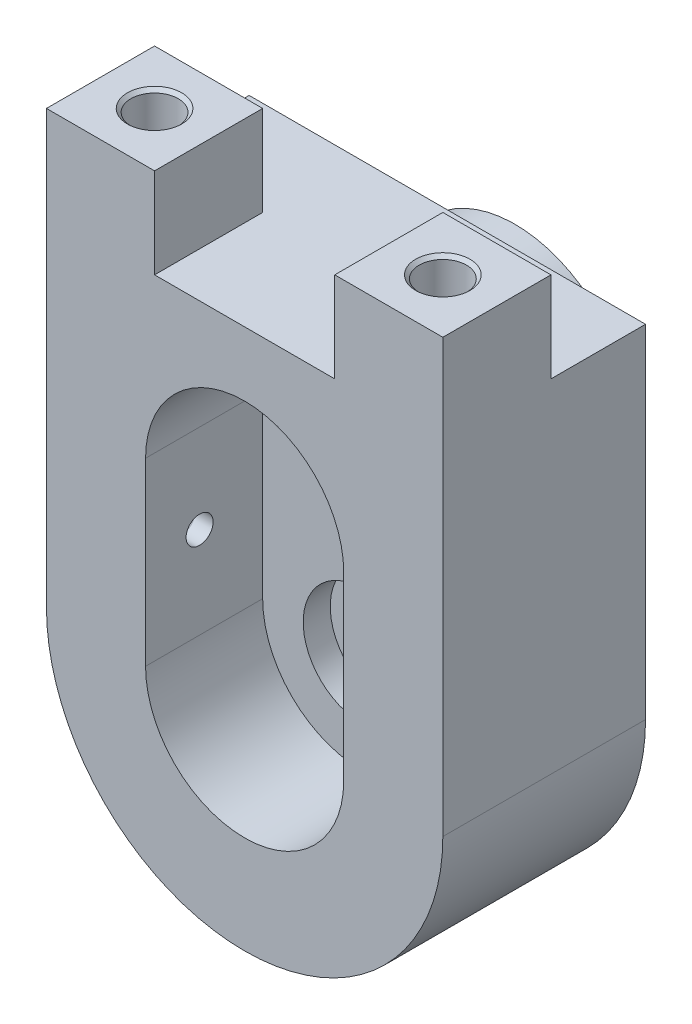
ISO-10303-21;
HEADER;
FILE_DESCRIPTION(('STEP AP214'),'2;1');
FILE_NAME('part.step','',(''),(''),'','','');
FILE_SCHEMA(('AUTOMOTIVE_DESIGN { 1 0 10303 214 1 1 1 1 }'));
ENDSEC;
DATA;
#1=APPLICATION_CONTEXT('core data for automotive mechanical design processes');
#2=APPLICATION_PROTOCOL_DEFINITION('international standard','automotive_design',2000,#1);
#3=PRODUCT_CONTEXT('',#1,'mechanical');
#4=PRODUCT('Part','Part','',(#3));
#5=PRODUCT_RELATED_PRODUCT_CATEGORY('part','',(#4));
#6=PRODUCT_DEFINITION_FORMATION('','',#4);
#7=PRODUCT_DEFINITION_CONTEXT('part definition',#1,'design');
#8=PRODUCT_DEFINITION('design','',#6,#7);
#9=PRODUCT_DEFINITION_SHAPE('','',#8);
#10=(LENGTH_UNIT() NAMED_UNIT(*) SI_UNIT(.MILLI.,.METRE.));
#11=(NAMED_UNIT(*) PLANE_ANGLE_UNIT() SI_UNIT($,.RADIAN.));
#12=(NAMED_UNIT(*) SI_UNIT($,.STERADIAN.) SOLID_ANGLE_UNIT());
#13=UNCERTAINTY_MEASURE_WITH_UNIT(LENGTH_MEASURE(1.E-05),#10,'distance_accuracy_value','');
#14=(GEOMETRIC_REPRESENTATION_CONTEXT(3) GLOBAL_UNCERTAINTY_ASSIGNED_CONTEXT((#13)) GLOBAL_UNIT_ASSIGNED_CONTEXT((#10,
#11,#12)) REPRESENTATION_CONTEXT('',''));
#15=CARTESIAN_POINT('',(0.,0.,0.));
#16=DIRECTION('',(0.,0.,1.));
#17=DIRECTION('',(1.,0.,0.));
#18=AXIS2_PLACEMENT_3D('',#15,#16,#17);
#19=CARTESIAN_POINT('',(-20.,56.2605194834472,45.));
#20=DIRECTION('',(-1.,0.,0.));
#21=DIRECTION('',(0.,0.,1.));
#22=AXIS2_PLACEMENT_3D('',#19,#20,#21);
#23=PLANE('',#22);
#24=DIRECTION('',(0.,0.,-1.));
#25=VECTOR('',#24,1.);
#26=CARTESIAN_POINT('',(-20.,36.2605194834471,45.));
#27=LINE('',#26,#25);
#28=CARTESIAN_POINT('',(-20.,36.2605194834471,45.));
#29=VERTEX_POINT('',#28);
#30=CARTESIAN_POINT('',(-20.,36.2605194834472,21.));
#31=VERTEX_POINT('',#30);
#32=EDGE_CURVE('E54',#29,#31,#27,.T.);
#33=ORIENTED_EDGE('',*,*,#32,.T.);
#34=DIRECTION('',(0.,1.,0.));
#35=VECTOR('',#34,1.);
#36=CARTESIAN_POINT('',(-20.,56.2605194834472,21.));
#37=LINE('',#36,#35);
#38=CARTESIAN_POINT('',(-20.,56.2605194834472,21.));
#39=VERTEX_POINT('',#38);
#40=EDGE_CURVE('E253',#31,#39,#37,.T.);
#41=ORIENTED_EDGE('',*,*,#40,.T.);
#42=DIRECTION('',(0.,0.,-1.));
#43=VECTOR('',#42,1.);
#44=CARTESIAN_POINT('',(-20.,56.2605194834472,45.));
#45=LINE('',#44,#43);
#46=CARTESIAN_POINT('',(-20.,56.2605194834472,45.));
#47=VERTEX_POINT('',#46);
#48=EDGE_CURVE('E376',#47,#39,#45,.T.);
#49=ORIENTED_EDGE('',*,*,#48,.F.);
#50=DIRECTION('',(0.,1.,0.));
#51=VECTOR('',#50,1.);
#52=CARTESIAN_POINT('',(-20.,56.2605194834472,45.));
#53=LINE('',#52,#51);
#54=EDGE_CURVE('E319',#29,#47,#53,.T.);
#55=ORIENTED_EDGE('',*,*,#54,.F.);
#56=EDGE_LOOP('',(#33,#41,#49,#55));
#57=FACE_BOUND('',#56,.T.);
#58=ADVANCED_FACE('F45',(#57),#23,.F.);
#59=CARTESIAN_POINT('',(-44.,56.2605194834472,45.));
#60=DIRECTION('',(0.,-1.,0.));
#61=DIRECTION('',(0.,0.,-1.));
#62=AXIS2_PLACEMENT_3D('',#59,#60,#61);
#63=PLANE('',#62);
#64=CARTESIAN_POINT('',(-32.,56.2605194834472,33.));
#65=DIRECTION('',(0.,1.,0.));
#66=DIRECTION('',(0.,0.,1.));
#67=AXIS2_PLACEMENT_3D('',#64,#65,#66);
#68=CIRCLE('',#67,6.025);
#69=CARTESIAN_POINT('',(-32.,56.2605194834472,39.025));
#70=VERTEX_POINT('',#69);
#71=EDGE_CURVE('E184',#70,#70,#68,.T.);
#72=ORIENTED_EDGE('',*,*,#71,.F.);
#73=EDGE_LOOP('',(#72));
#74=FACE_BOUND('',#73,.T.);
#75=ORIENTED_EDGE('',*,*,#48,.T.);
#76=DIRECTION('',(-1.,0.,0.));
#77=VECTOR('',#76,1.);
#78=CARTESIAN_POINT('',(-44.,56.2605194834472,21.));
#79=LINE('',#78,#77);
#80=CARTESIAN_POINT('',(-44.,56.2605194834472,21.));
#81=VERTEX_POINT('',#80);
#82=EDGE_CURVE('E249',#39,#81,#79,.T.);
#83=ORIENTED_EDGE('',*,*,#82,.T.);
#84=DIRECTION('',(0.,0.,-1.));
#85=VECTOR('',#84,1.);
#86=CARTESIAN_POINT('',(-44.,56.2605194834472,45.));
#87=LINE('',#86,#85);
#88=CARTESIAN_POINT('',(-44.,56.2605194834472,45.));
#89=VERTEX_POINT('',#88);
#90=EDGE_CURVE('E372',#89,#81,#87,.T.);
#91=ORIENTED_EDGE('',*,*,#90,.F.);
#92=DIRECTION('',(-1.,0.,0.));
#93=VECTOR('',#92,1.);
#94=CARTESIAN_POINT('',(-44.,56.2605194834472,45.));
#95=LINE('',#94,#93);
#96=EDGE_CURVE('E322',#47,#89,#95,.T.);
#97=ORIENTED_EDGE('',*,*,#96,.F.);
#98=EDGE_LOOP('',(#75,#83,#91,#97));
#99=FACE_BOUND('',#98,.T.);
#100=ADVANCED_FACE('F451',(#74,#99),#63,.F.);
#101=CARTESIAN_POINT('',(-44.,-39.7394805165529,45.));
#102=DIRECTION('',(1.,0.,0.));
#103=DIRECTION('',(0.,0.,-1.));
#104=AXIS2_PLACEMENT_3D('',#101,#102,#103);
#105=PLANE('',#104);
#106=ORIENTED_EDGE('',*,*,#90,.T.);
#107=DIRECTION('',(0.,-1.,0.));
#108=VECTOR('',#107,1.);
#109=CARTESIAN_POINT('',(-44.,84.7903704289425,21.));
#110=LINE('',#109,#108);
#111=CARTESIAN_POINT('',(-44.,36.2605194834472,21.));
#112=VERTEX_POINT('',#111);
#113=EDGE_CURVE('E219',#81,#112,#110,.T.);
#114=ORIENTED_EDGE('',*,*,#113,.T.);
#115=DIRECTION('',(0.,0.,-1.));
#116=VECTOR('',#115,1.);
#117=CARTESIAN_POINT('',(-44.,36.2605194834472,21.));
#118=LINE('',#117,#116);
#119=CARTESIAN_POINT('',(-44.,36.2605194834472,0.));
#120=VERTEX_POINT('',#119);
#121=EDGE_CURVE('E224',#112,#120,#118,.T.);
#122=ORIENTED_EDGE('',*,*,#121,.T.);
#123=DIRECTION('',(0.,-1.,0.));
#124=VECTOR('',#123,1.);
#125=CARTESIAN_POINT('',(-44.,-39.7394805165529,0.));
#126=LINE('',#125,#124);
#127=CARTESIAN_POINT('',(-44.,-39.7394805165529,0.));
#128=VERTEX_POINT('',#127);
#129=EDGE_CURVE('E306',#120,#128,#126,.T.);
#130=ORIENTED_EDGE('',*,*,#129,.T.);
#131=DIRECTION('',(0.,0.,-1.));
#132=VECTOR('',#131,1.);
#133=CARTESIAN_POINT('',(-44.,-39.7394805165529,45.));
#134=LINE('',#133,#132);
#135=CARTESIAN_POINT('',(-44.,-39.7394805165529,45.));
#136=VERTEX_POINT('',#135);
#137=EDGE_CURVE('E368',#136,#128,#134,.T.);
#138=ORIENTED_EDGE('',*,*,#137,.F.);
#139=DIRECTION('',(0.,-1.,0.));
#140=VECTOR('',#139,1.);
#141=CARTESIAN_POINT('',(-44.,-39.7394805165529,45.));
#142=LINE('',#141,#140);
#143=EDGE_CURVE('E325',#89,#136,#142,.T.);
#144=ORIENTED_EDGE('',*,*,#143,.F.);
#145=EDGE_LOOP('',(#106,#114,#122,#130,#138,#144));
#146=FACE_BOUND('',#145,.T.);
#147=ADVANCED_FACE('F456',(#146),#105,.F.);
#148=CARTESIAN_POINT('',(0.,-39.7394805165529,45.));
#149=DIRECTION('',(0.,0.,-1.));
#150=DIRECTION('',(-1.,0.,0.));
#151=AXIS2_PLACEMENT_3D('',#148,#149,#150);
#152=CYLINDRICAL_SURFACE('',#151,44.);
#153=CARTESIAN_POINT('',(0.,-39.7394805165529,0.));
#154=DIRECTION('',(0.,0.,1.));
#155=DIRECTION('',(-1.,0.,0.));
#156=AXIS2_PLACEMENT_3D('',#153,#154,#155);
#157=CIRCLE('',#156,44.);
#158=CARTESIAN_POINT('',(44.,-39.7394805165528,0.));
#159=VERTEX_POINT('',#158);
#160=EDGE_CURVE('E344',#128,#159,#157,.T.);
#161=ORIENTED_EDGE('',*,*,#160,.T.);
#162=DIRECTION('',(0.,0.,-1.));
#163=VECTOR('',#162,1.);
#164=CARTESIAN_POINT('',(44.,-39.7394805165528,45.));
#165=LINE('',#164,#163);
#166=CARTESIAN_POINT('',(44.,-39.7394805165528,45.));
#167=VERTEX_POINT('',#166);
#168=EDGE_CURVE('E364',#167,#159,#165,.T.);
#169=ORIENTED_EDGE('',*,*,#168,.F.);
#170=CARTESIAN_POINT('',(0.,-39.7394805165529,45.));
#171=DIRECTION('',(0.,0.,1.));
#172=DIRECTION('',(-1.,0.,0.));
#173=AXIS2_PLACEMENT_3D('',#170,#171,#172);
#174=CIRCLE('',#173,44.);
#175=EDGE_CURVE('E328',#136,#167,#174,.T.);
#176=ORIENTED_EDGE('',*,*,#175,.F.);
#177=ORIENTED_EDGE('',*,*,#137,.T.);
#178=EDGE_LOOP('',(#161,#169,#176,#177));
#179=FACE_BOUND('',#178,.T.);
#180=ADVANCED_FACE('F489',(#179),#152,.T.);
#181=CARTESIAN_POINT('',(44.,56.2605194834472,45.));
#182=DIRECTION('',(-1.,0.,0.));
#183=DIRECTION('',(0.,-1.,0.));
#184=AXIS2_PLACEMENT_3D('',#181,#182,#183);
#185=PLANE('',#184);
#186=DIRECTION('',(0.,0.,1.));
#187=VECTOR('',#186,1.);
#188=CARTESIAN_POINT('',(44.,36.2605194834472,45.));
#189=LINE('',#188,#187);
#190=CARTESIAN_POINT('',(44.,36.2605194834472,0.));
#191=VERTEX_POINT('',#190);
#192=CARTESIAN_POINT('',(44.,36.2605194834472,21.));
#193=VERTEX_POINT('',#192);
#194=EDGE_CURVE('E233',#191,#193,#189,.T.);
#195=ORIENTED_EDGE('',*,*,#194,.T.);
#196=DIRECTION('',(0.,1.,0.));
#197=VECTOR('',#196,1.);
#198=CARTESIAN_POINT('',(44.,56.2605194834472,21.));
#199=LINE('',#198,#197);
#200=CARTESIAN_POINT('',(44.,56.2605194834472,21.));
#201=VERTEX_POINT('',#200);
#202=EDGE_CURVE('E245',#193,#201,#199,.T.);
#203=ORIENTED_EDGE('',*,*,#202,.T.);
#204=DIRECTION('',(0.,0.,-1.));
#205=VECTOR('',#204,1.);
#206=CARTESIAN_POINT('',(44.,56.2605194834472,45.));
#207=LINE('',#206,#205);
#208=CARTESIAN_POINT('',(44.,56.2605194834472,45.));
#209=VERTEX_POINT('',#208);
#210=EDGE_CURVE('E360',#209,#201,#207,.T.);
#211=ORIENTED_EDGE('',*,*,#210,.F.);
#212=DIRECTION('',(0.,1.,0.));
#213=VECTOR('',#212,1.);
#214=CARTESIAN_POINT('',(44.,56.2605194834472,45.));
#215=LINE('',#214,#213);
#216=EDGE_CURVE('E331',#167,#209,#215,.T.);
#217=ORIENTED_EDGE('',*,*,#216,.F.);
#218=ORIENTED_EDGE('',*,*,#168,.T.);
#219=DIRECTION('',(0.,1.,0.));
#220=VECTOR('',#219,1.);
#221=CARTESIAN_POINT('',(44.,56.2605194834472,0.));
#222=LINE('',#221,#220);
#223=EDGE_CURVE('E347',#159,#191,#222,.T.);
#224=ORIENTED_EDGE('',*,*,#223,.T.);
#225=EDGE_LOOP('',(#195,#203,#211,#217,#218,#224));
#226=FACE_BOUND('',#225,.T.);
#227=ADVANCED_FACE('F484',(#226),#185,.F.);
#228=CARTESIAN_POINT('',(20.,56.2605194834472,45.));
#229=DIRECTION('',(0.,-1.,0.));
#230=DIRECTION('',(1.,0.,0.));
#231=AXIS2_PLACEMENT_3D('',#228,#229,#230);
#232=PLANE('',#231);
#233=CARTESIAN_POINT('',(32.,56.2605194834472,33.));
#234=DIRECTION('',(0.,1.,0.));
#235=DIRECTION('',(0.,0.,1.));
#236=AXIS2_PLACEMENT_3D('',#233,#234,#235);
#237=CIRCLE('',#236,6.025);
#238=CARTESIAN_POINT('',(32.,56.2605194834472,39.025));
#239=VERTEX_POINT('',#238);
#240=EDGE_CURVE('E196',#239,#239,#237,.T.);
#241=ORIENTED_EDGE('',*,*,#240,.F.);
#242=EDGE_LOOP('',(#241));
#243=FACE_BOUND('',#242,.T.);
#244=ORIENTED_EDGE('',*,*,#210,.T.);
#245=DIRECTION('',(-1.,0.,0.));
#246=VECTOR('',#245,1.);
#247=CARTESIAN_POINT('',(20.,56.2605194834472,21.));
#248=LINE('',#247,#246);
#249=CARTESIAN_POINT('',(20.,56.2605194834472,21.));
#250=VERTEX_POINT('',#249);
#251=EDGE_CURVE('E241',#201,#250,#248,.T.);
#252=ORIENTED_EDGE('',*,*,#251,.T.);
#253=DIRECTION('',(0.,0.,-1.));
#254=VECTOR('',#253,1.);
#255=CARTESIAN_POINT('',(20.,56.2605194834472,45.));
#256=LINE('',#255,#254);
#257=CARTESIAN_POINT('',(20.,56.2605194834472,45.));
#258=VERTEX_POINT('',#257);
#259=EDGE_CURVE('E356',#258,#250,#256,.T.);
#260=ORIENTED_EDGE('',*,*,#259,.F.);
#261=DIRECTION('',(-1.,0.,0.));
#262=VECTOR('',#261,1.);
#263=CARTESIAN_POINT('',(20.,56.2605194834472,45.));
#264=LINE('',#263,#262);
#265=EDGE_CURVE('E334',#209,#258,#264,.T.);
#266=ORIENTED_EDGE('',*,*,#265,.F.);
#267=EDGE_LOOP('',(#244,#252,#260,#266));
#268=FACE_BOUND('',#267,.T.);
#269=ADVANCED_FACE('F491',(#243,#268),#232,.F.);
#270=CARTESIAN_POINT('',(20.,36.2605194834472,45.));
#271=DIRECTION('',(1.,0.,0.));
#272=DIRECTION('',(0.,1.,0.));
#273=AXIS2_PLACEMENT_3D('',#270,#271,#272);
#274=PLANE('',#273);
#275=ORIENTED_EDGE('',*,*,#259,.T.);
#276=DIRECTION('',(0.,-1.,0.));
#277=VECTOR('',#276,1.);
#278=CARTESIAN_POINT('',(20.,36.2605194834472,21.));
#279=LINE('',#278,#277);
#280=CARTESIAN_POINT('',(20.,36.2605194834472,21.));
#281=VERTEX_POINT('',#280);
#282=EDGE_CURVE('E237',#250,#281,#279,.T.);
#283=ORIENTED_EDGE('',*,*,#282,.T.);
#284=DIRECTION('',(0.,0.,-1.));
#285=VECTOR('',#284,1.);
#286=CARTESIAN_POINT('',(20.,36.2605194834472,45.));
#287=LINE('',#286,#285);
#288=CARTESIAN_POINT('',(20.,36.2605194834472,45.));
#289=VERTEX_POINT('',#288);
#290=EDGE_CURVE('E341',#289,#281,#287,.T.);
#291=ORIENTED_EDGE('',*,*,#290,.F.);
#292=DIRECTION('',(0.,-1.,0.));
#293=VECTOR('',#292,1.);
#294=CARTESIAN_POINT('',(20.,36.2605194834472,45.));
#295=LINE('',#294,#293);
#296=EDGE_CURVE('E337',#258,#289,#295,.T.);
#297=ORIENTED_EDGE('',*,*,#296,.F.);
#298=EDGE_LOOP('',(#275,#283,#291,#297));
#299=FACE_BOUND('',#298,.T.);
#300=ADVANCED_FACE('F479',(#299),#274,.F.);
#301=CARTESIAN_POINT('',(5.476321218145,36.2605194834471,45.));
#302=DIRECTION('',(0.,-1.,0.));
#303=DIRECTION('',(1.,0.,0.));
#304=AXIS2_PLACEMENT_3D('',#301,#302,#303);
#305=PLANE('',#304);
#306=ORIENTED_EDGE('',*,*,#290,.T.);
#307=DIRECTION('',(1.,0.,0.));
#308=VECTOR('',#307,1.);
#309=CARTESIAN_POINT('',(-44.,36.2605194834472,21.));
#310=LINE('',#309,#308);
#311=EDGE_CURVE('E228',#281,#193,#310,.T.);
#312=ORIENTED_EDGE('',*,*,#311,.T.);
#313=ORIENTED_EDGE('',*,*,#194,.F.);
#314=DIRECTION('',(-1.,0.,0.));
#315=VECTOR('',#314,1.);
#316=CARTESIAN_POINT('',(5.476321218145,36.2605194834471,0.));
#317=LINE('',#316,#315);
#318=EDGE_CURVE('E62',#191,#120,#317,.T.);
#319=ORIENTED_EDGE('',*,*,#318,.T.);
#320=ORIENTED_EDGE('',*,*,#121,.F.);
#321=EDGE_CURVE('E229',#112,#31,#310,.T.);
#322=ORIENTED_EDGE('',*,*,#321,.T.);
#323=ORIENTED_EDGE('',*,*,#32,.F.);
#324=DIRECTION('',(-1.,0.,0.));
#325=VECTOR('',#324,1.);
#326=CARTESIAN_POINT('',(-20.,36.2605194834471,45.));
#327=LINE('',#326,#325);
#328=EDGE_CURVE('E315',#289,#29,#327,.T.);
#329=ORIENTED_EDGE('',*,*,#328,.F.);
#330=EDGE_LOOP('',(#306,#312,#313,#319,#320,#322,#323,#329));
#331=FACE_BOUND('',#330,.T.);
#332=ADVANCED_FACE('F461',(#331),#305,.F.);
#333=CARTESIAN_POINT('',(0.,-39.7394805165529,45.));
#334=DIRECTION('',(0.,0.,-1.));
#335=DIRECTION('',(-1.,0.,0.));
#336=AXIS2_PLACEMENT_3D('',#333,#334,#335);
#337=PLANE('',#336);
#338=DIRECTION('',(0.,-1.,0.));
#339=VECTOR('',#338,1.);
#340=CARTESIAN_POINT('',(-22.,0.,45.));
#341=LINE('',#340,#339);
#342=CARTESIAN_POINT('',(-22.,0.,45.));
#343=VERTEX_POINT('',#342);
#344=CARTESIAN_POINT('',(-22.,-40.,45.));
#345=VERTEX_POINT('',#344);
#346=EDGE_CURVE('E292',#343,#345,#341,.T.);
#347=ORIENTED_EDGE('',*,*,#346,.F.);
#348=CARTESIAN_POINT('',(0.,0.,45.));
#349=DIRECTION('',(0.,0.,1.));
#350=DIRECTION('',(1.,0.,0.));
#351=AXIS2_PLACEMENT_3D('',#348,#349,#350);
#352=CIRCLE('',#351,22.);
#353=CARTESIAN_POINT('',(22.,0.,45.));
#354=VERTEX_POINT('',#353);
#355=EDGE_CURVE('E70',#354,#343,#352,.T.);
#356=ORIENTED_EDGE('',*,*,#355,.F.);
#357=DIRECTION('',(0.,-1.,0.));
#358=VECTOR('',#357,1.);
#359=CARTESIAN_POINT('',(22.,0.,45.));
#360=LINE('',#359,#358);
#361=CARTESIAN_POINT('',(22.,-40.,45.));
#362=VERTEX_POINT('',#361);
#363=EDGE_CURVE('E278',#354,#362,#360,.T.);
#364=ORIENTED_EDGE('',*,*,#363,.T.);
#365=CARTESIAN_POINT('',(0.,-40.,45.));
#366=DIRECTION('',(0.,0.,1.));
#367=DIRECTION('',(1.,0.,0.));
#368=AXIS2_PLACEMENT_3D('',#365,#366,#367);
#369=CIRCLE('',#368,22.);
#370=EDGE_CURVE('E296',#345,#362,#369,.T.);
#371=ORIENTED_EDGE('',*,*,#370,.F.);
#372=EDGE_LOOP('',(#347,#356,#364,#371));
#373=FACE_BOUND('',#372,.T.);
#374=ORIENTED_EDGE('',*,*,#328,.T.);
#375=ORIENTED_EDGE('',*,*,#54,.T.);
#376=ORIENTED_EDGE('',*,*,#96,.T.);
#377=ORIENTED_EDGE('',*,*,#143,.T.);
#378=ORIENTED_EDGE('',*,*,#175,.T.);
#379=ORIENTED_EDGE('',*,*,#216,.T.);
#380=ORIENTED_EDGE('',*,*,#265,.T.);
#381=ORIENTED_EDGE('',*,*,#296,.T.);
#382=EDGE_LOOP('',(#374,#375,#376,#377,#378,#379,#380,#381));
#383=FACE_BOUND('',#382,.T.);
#384=ADVANCED_FACE('F425',(#373,#383),#337,.F.);
#385=CARTESIAN_POINT('',(0.,-39.7394805165529,0.));
#386=DIRECTION('',(0.,0.,-1.));
#387=DIRECTION('',(-1.,0.,0.));
#388=AXIS2_PLACEMENT_3D('',#385,#386,#387);
#389=PLANE('',#388);
#390=CARTESIAN_POINT('',(0.,29.,0.));
#391=DIRECTION('',(0.,0.,-1.));
#392=DIRECTION('',(-1.,0.,0.));
#393=AXIS2_PLACEMENT_3D('',#390,#391,#392);
#394=CIRCLE('',#393,2.525);
#395=CARTESIAN_POINT('',(-2.525,29.,0.));
#396=VERTEX_POINT('',#395);
#397=EDGE_CURVE('E173',#396,#396,#394,.T.);
#398=ORIENTED_EDGE('',*,*,#397,.F.);
#399=EDGE_LOOP('',(#398));
#400=FACE_BOUND('',#399,.T.);
#401=CARTESIAN_POINT('',(0.,-72.,0.));
#402=DIRECTION('',(0.,0.,-1.));
#403=DIRECTION('',(-1.,0.,0.));
#404=AXIS2_PLACEMENT_3D('',#401,#402,#403);
#405=CIRCLE('',#404,2.525);
#406=CARTESIAN_POINT('',(-2.525,-72.,0.));
#407=VERTEX_POINT('',#406);
#408=EDGE_CURVE('E164',#407,#407,#405,.T.);
#409=ORIENTED_EDGE('',*,*,#408,.F.);
#410=EDGE_LOOP('',(#409));
#411=FACE_BOUND('',#410,.T.);
#412=CARTESIAN_POINT('',(0.,0.,0.));
#413=DIRECTION('',(0.,0.,-1.));
#414=DIRECTION('',(-1.,0.,0.));
#415=AXIS2_PLACEMENT_3D('',#412,#413,#414);
#416=CIRCLE('',#415,26.);
#417=CARTESIAN_POINT('',(-26.,0.,0.));
#418=VERTEX_POINT('',#417);
#419=EDGE_CURVE('E11',#418,#418,#416,.T.);
#420=ORIENTED_EDGE('',*,*,#419,.F.);
#421=EDGE_LOOP('',(#420));
#422=FACE_BOUND('',#421,.T.);
#423=ORIENTED_EDGE('',*,*,#318,.F.);
#424=ORIENTED_EDGE('',*,*,#223,.F.);
#425=ORIENTED_EDGE('',*,*,#160,.F.);
#426=ORIENTED_EDGE('',*,*,#129,.F.);
#427=EDGE_LOOP('',(#423,#424,#425,#426));
#428=FACE_BOUND('',#427,.T.);
#429=ADVANCED_FACE('F421',(#400,#411,#422,#428),#389,.T.);
#430=CARTESIAN_POINT('',(0.,0.,19.));
#431=DIRECTION('',(0.,0.,1.));
#432=DIRECTION('',(1.,0.,0.));
#433=AXIS2_PLACEMENT_3D('',#430,#431,#432);
#434=CYLINDRICAL_SURFACE('',#433,22.);
#435=ORIENTED_EDGE('',*,*,#355,.T.);
#436=DIRECTION('',(0.,0.,1.));
#437=VECTOR('',#436,1.);
#438=CARTESIAN_POINT('',(-22.,0.,19.));
#439=LINE('',#438,#437);
#440=CARTESIAN_POINT('',(-22.,0.,19.));
#441=VERTEX_POINT('',#440);
#442=EDGE_CURVE('E289',#441,#343,#439,.T.);
#443=ORIENTED_EDGE('',*,*,#442,.F.);
#444=CARTESIAN_POINT('',(0.,0.,19.));
#445=DIRECTION('',(0.,0.,1.));
#446=DIRECTION('',(1.,0.,0.));
#447=AXIS2_PLACEMENT_3D('',#444,#445,#446);
#448=CIRCLE('',#447,22.);
#449=CARTESIAN_POINT('',(22.,0.,19.));
#450=VERTEX_POINT('',#449);
#451=EDGE_CURVE('E273',#450,#441,#448,.T.);
#452=ORIENTED_EDGE('',*,*,#451,.F.);
#453=DIRECTION('',(0.,0.,1.));
#454=VECTOR('',#453,1.);
#455=CARTESIAN_POINT('',(22.,0.,19.));
#456=LINE('',#455,#454);
#457=EDGE_CURVE('E303',#450,#354,#456,.T.);
#458=ORIENTED_EDGE('',*,*,#457,.T.);
#459=EDGE_LOOP('',(#435,#443,#452,#458));
#460=FACE_BOUND('',#459,.T.);
#461=ADVANCED_FACE('F424',(#460),#434,.F.);
#462=CARTESIAN_POINT('',(22.,0.,19.));
#463=DIRECTION('',(-1.,0.,0.));
#464=DIRECTION('',(0.,-1.,0.));
#465=AXIS2_PLACEMENT_3D('',#462,#463,#464);
#466=PLANE('',#465);
#467=CARTESIAN_POINT('',(22.,-19.7394805165528,33.));
#468=DIRECTION('',(-1.,0.,0.));
#469=DIRECTION('',(0.,-1.,0.));
#470=AXIS2_PLACEMENT_3D('',#467,#468,#469);
#471=CIRCLE('',#470,3.);
#472=CARTESIAN_POINT('',(22.,-22.7394805165528,33.));
#473=VERTEX_POINT('',#472);
#474=EDGE_CURVE('E48',#473,#473,#471,.T.);
#475=ORIENTED_EDGE('',*,*,#474,.F.);
#476=EDGE_LOOP('',(#475));
#477=FACE_BOUND('',#476,.T.);
#478=ORIENTED_EDGE('',*,*,#363,.F.);
#479=ORIENTED_EDGE('',*,*,#457,.F.);
#480=DIRECTION('',(0.,-1.,0.));
#481=VECTOR('',#480,1.);
#482=CARTESIAN_POINT('',(22.,0.,19.));
#483=LINE('',#482,#481);
#484=CARTESIAN_POINT('',(22.,-40.,19.));
#485=VERTEX_POINT('',#484);
#486=EDGE_CURVE('E286',#450,#485,#483,.T.);
#487=ORIENTED_EDGE('',*,*,#486,.T.);
#488=DIRECTION('',(0.,0.,1.));
#489=VECTOR('',#488,1.);
#490=CARTESIAN_POINT('',(22.,-40.,19.));
#491=LINE('',#490,#489);
#492=EDGE_CURVE('E307',#485,#362,#491,.T.);
#493=ORIENTED_EDGE('',*,*,#492,.T.);
#494=EDGE_LOOP('',(#478,#479,#487,#493));
#495=FACE_BOUND('',#494,.T.);
#496=ADVANCED_FACE('F517',(#477,#495),#466,.T.);
#497=CARTESIAN_POINT('',(0.,-40.,19.));
#498=DIRECTION('',(0.,0.,1.));
#499=DIRECTION('',(1.,0.,0.));
#500=AXIS2_PLACEMENT_3D('',#497,#498,#499);
#501=CYLINDRICAL_SURFACE('',#500,22.);
#502=ORIENTED_EDGE('',*,*,#370,.T.);
#503=ORIENTED_EDGE('',*,*,#492,.F.);
#504=CARTESIAN_POINT('',(0.,-40.,19.));
#505=DIRECTION('',(0.,0.,1.));
#506=DIRECTION('',(1.,0.,0.));
#507=AXIS2_PLACEMENT_3D('',#504,#505,#506);
#508=CIRCLE('',#507,22.);
#509=CARTESIAN_POINT('',(-22.,-40.,19.));
#510=VERTEX_POINT('',#509);
#511=EDGE_CURVE('E282',#510,#485,#508,.T.);
#512=ORIENTED_EDGE('',*,*,#511,.F.);
#513=DIRECTION('',(0.,0.,1.));
#514=VECTOR('',#513,1.);
#515=CARTESIAN_POINT('',(-22.,-40.,19.));
#516=LINE('',#515,#514);
#517=EDGE_CURVE('E310',#510,#345,#516,.T.);
#518=ORIENTED_EDGE('',*,*,#517,.T.);
#519=EDGE_LOOP('',(#502,#503,#512,#518));
#520=FACE_BOUND('',#519,.T.);
#521=ADVANCED_FACE('F520',(#520),#501,.F.);
#522=CARTESIAN_POINT('',(-22.,0.,19.));
#523=DIRECTION('',(-1.,0.,0.));
#524=DIRECTION('',(0.,-1.,0.));
#525=AXIS2_PLACEMENT_3D('',#522,#523,#524);
#526=PLANE('',#525);
#527=CARTESIAN_POINT('',(-22.,-19.7394805165528,33.));
#528=DIRECTION('',(-1.,0.,0.));
#529=DIRECTION('',(0.,-1.,0.));
#530=AXIS2_PLACEMENT_3D('',#527,#528,#529);
#531=CIRCLE('',#530,3.);
#532=CARTESIAN_POINT('',(-22.,-22.7394805165528,33.));
#533=VERTEX_POINT('',#532);
#534=EDGE_CURVE('E387',#533,#533,#531,.T.);
#535=ORIENTED_EDGE('',*,*,#534,.T.);
#536=EDGE_LOOP('',(#535));
#537=FACE_BOUND('',#536,.T.);
#538=ORIENTED_EDGE('',*,*,#346,.T.);
#539=ORIENTED_EDGE('',*,*,#517,.F.);
#540=DIRECTION('',(0.,-1.,0.));
#541=VECTOR('',#540,1.);
#542=CARTESIAN_POINT('',(-22.,0.,19.));
#543=LINE('',#542,#541);
#544=EDGE_CURVE('E277',#441,#510,#543,.T.);
#545=ORIENTED_EDGE('',*,*,#544,.F.);
#546=ORIENTED_EDGE('',*,*,#442,.T.);
#547=EDGE_LOOP('',(#538,#539,#545,#546));
#548=FACE_BOUND('',#547,.T.);
#549=ADVANCED_FACE('F515',(#537,#548),#526,.F.);
#550=CARTESIAN_POINT('',(0.,0.,19.));
#551=DIRECTION('',(0.,0.,1.));
#552=DIRECTION('',(1.,0.,0.));
#553=AXIS2_PLACEMENT_3D('',#550,#551,#552);
#554=PLANE('',#553);
#555=CARTESIAN_POINT('',(0.,-40.,19.));
#556=DIRECTION('',(0.,0.,1.));
#557=DIRECTION('',(1.,0.,0.));
#558=AXIS2_PLACEMENT_3D('',#555,#556,#557);
#559=CIRCLE('',#558,13.);
#560=CARTESIAN_POINT('',(13.,-40.,19.));
#561=VERTEX_POINT('',#560);
#562=EDGE_CURVE('E257',#561,#561,#559,.T.);
#563=ORIENTED_EDGE('',*,*,#562,.F.);
#564=EDGE_LOOP('',(#563));
#565=FACE_BOUND('',#564,.T.);
#566=CARTESIAN_POINT('',(0.,0.,19.));
#567=DIRECTION('',(0.,0.,1.));
#568=DIRECTION('',(1.,0.,0.));
#569=AXIS2_PLACEMENT_3D('',#566,#567,#568);
#570=CIRCLE('',#569,13.);
#571=CARTESIAN_POINT('',(13.,0.,19.));
#572=VERTEX_POINT('',#571);
#573=EDGE_CURVE('E262',#572,#572,#570,.T.);
#574=ORIENTED_EDGE('',*,*,#573,.F.);
#575=EDGE_LOOP('',(#574));
#576=FACE_BOUND('',#575,.T.);
#577=ORIENTED_EDGE('',*,*,#451,.T.);
#578=ORIENTED_EDGE('',*,*,#544,.T.);
#579=ORIENTED_EDGE('',*,*,#511,.T.);
#580=ORIENTED_EDGE('',*,*,#486,.F.);
#581=EDGE_LOOP('',(#577,#578,#579,#580));
#582=FACE_BOUND('',#581,.T.);
#583=ADVANCED_FACE('F511',(#565,#576,#582),#554,.T.);
#584=CARTESIAN_POINT('',(0.,0.,0.));
#585=DIRECTION('',(0.,0.,1.));
#586=DIRECTION('',(1.,0.,0.));
#587=AXIS2_PLACEMENT_3D('',#584,#585,#586);
#588=CYLINDRICAL_SURFACE('',#587,13.);
#589=CARTESIAN_POINT('',(0.,0.,0.));
#590=DIRECTION('',(0.,0.,1.));
#591=DIRECTION('',(1.,0.,0.));
#592=AXIS2_PLACEMENT_3D('',#589,#590,#591);
#593=CIRCLE('',#592,13.);
#594=CARTESIAN_POINT('',(13.,0.,0.));
#595=VERTEX_POINT('',#594);
#596=EDGE_CURVE('E266',#595,#595,#593,.T.);
#597=ORIENTED_EDGE('',*,*,#596,.F.);
#598=EDGE_LOOP('',(#597));
#599=FACE_BOUND('',#598,.T.);
#600=ORIENTED_EDGE('',*,*,#573,.T.);
#601=EDGE_LOOP('',(#600));
#602=FACE_BOUND('',#601,.T.);
#603=ADVANCED_FACE('F507',(#599,#602),#588,.F.);
#604=CARTESIAN_POINT('',(0.,-40.,13.));
#605=DIRECTION('',(0.,0.,1.));
#606=DIRECTION('',(1.,0.,0.));
#607=AXIS2_PLACEMENT_3D('',#604,#605,#606);
#608=CYLINDRICAL_SURFACE('',#607,13.);
#609=CARTESIAN_POINT('',(0.,-40.,13.));
#610=DIRECTION('',(0.,0.,1.));
#611=DIRECTION('',(1.,0.,0.));
#612=AXIS2_PLACEMENT_3D('',#609,#610,#611);
#613=CIRCLE('',#612,13.);
#614=CARTESIAN_POINT('',(13.,-40.,13.));
#615=VERTEX_POINT('',#614);
#616=EDGE_CURVE('E258',#615,#615,#613,.T.);
#617=ORIENTED_EDGE('',*,*,#616,.F.);
#618=EDGE_LOOP('',(#617));
#619=FACE_BOUND('',#618,.T.);
#620=ORIENTED_EDGE('',*,*,#562,.T.);
#621=EDGE_LOOP('',(#620));
#622=FACE_BOUND('',#621,.T.);
#623=ADVANCED_FACE('F503',(#619,#622),#608,.F.);
#624=CARTESIAN_POINT('',(0.,-40.,13.));
#625=DIRECTION('',(0.,0.,1.));
#626=DIRECTION('',(1.,0.,0.));
#627=AXIS2_PLACEMENT_3D('',#624,#625,#626);
#628=PLANE('',#627);
#629=ORIENTED_EDGE('',*,*,#616,.T.);
#630=EDGE_LOOP('',(#629));
#631=FACE_BOUND('',#630,.T.);
#632=ADVANCED_FACE('F499',(#631),#628,.T.);
#633=CARTESIAN_POINT('',(-44.,84.7903704289425,21.));
#634=DIRECTION('',(0.,0.,1.));
#635=DIRECTION('',(0.,-1.,0.));
#636=AXIS2_PLACEMENT_3D('',#633,#634,#635);
#637=PLANE('',#636);
#638=ORIENTED_EDGE('',*,*,#321,.F.);
#639=ORIENTED_EDGE('',*,*,#113,.F.);
#640=ORIENTED_EDGE('',*,*,#82,.F.);
#641=ORIENTED_EDGE('',*,*,#40,.F.);
#642=EDGE_LOOP('',(#638,#639,#640,#641));
#643=FACE_BOUND('',#642,.T.);
#644=ADVANCED_FACE('F464',(#643),#637,.F.);
#645=ORIENTED_EDGE('',*,*,#311,.F.);
#646=ORIENTED_EDGE('',*,*,#282,.F.);
#647=ORIENTED_EDGE('',*,*,#251,.F.);
#648=ORIENTED_EDGE('',*,*,#202,.F.);
#649=EDGE_LOOP('',(#645,#646,#647,#648));
#650=FACE_BOUND('',#649,.T.);
#651=ADVANCED_FACE('F492',(#650),#637,.F.);
#652=CARTESIAN_POINT('',(0.,0.,0.));
#653=DIRECTION('',(0.,0.,-1.));
#654=DIRECTION('',(-1.,0.,0.));
#655=AXIS2_PLACEMENT_3D('',#652,#653,#654);
#656=PLANE('',#655);
#657=CARTESIAN_POINT('',(0.,0.,0.));
#658=DIRECTION('',(0.,0.,-1.));
#659=DIRECTION('',(-1.,0.,0.));
#660=AXIS2_PLACEMENT_3D('',#657,#658,#659);
#661=CIRCLE('',#660,11.);
#662=CARTESIAN_POINT('',(-11.,0.,0.));
#663=VERTEX_POINT('',#662);
#664=EDGE_CURVE('E208',#663,#663,#661,.T.);
#665=ORIENTED_EDGE('',*,*,#664,.T.);
#666=EDGE_LOOP('',(#665));
#667=FACE_BOUND('',#666,.T.);
#668=ORIENTED_EDGE('',*,*,#596,.T.);
#669=EDGE_LOOP('',(#668));
#670=FACE_BOUND('',#669,.T.);
#671=ADVANCED_FACE('F444',(#667,#670),#656,.F.);
#672=CARTESIAN_POINT('',(0.,0.,-15.));
#673=DIRECTION('',(0.,0.,-1.));
#674=DIRECTION('',(-1.,0.,0.));
#675=AXIS2_PLACEMENT_3D('',#672,#673,#674);
#676=PLANE('',#675);
#677=CARTESIAN_POINT('',(0.,0.,-15.));
#678=DIRECTION('',(0.,0.,-1.));
#679=DIRECTION('',(-1.,0.,0.));
#680=AXIS2_PLACEMENT_3D('',#677,#678,#679);
#681=CIRCLE('',#680,26.);
#682=CARTESIAN_POINT('',(-26.,0.,-15.));
#683=VERTEX_POINT('',#682);
#684=EDGE_CURVE('E213',#683,#683,#681,.T.);
#685=ORIENTED_EDGE('',*,*,#684,.T.);
#686=EDGE_LOOP('',(#685));
#687=FACE_BOUND('',#686,.T.);
#688=CARTESIAN_POINT('',(0.,0.,-15.));
#689=DIRECTION('',(0.,0.,-1.));
#690=DIRECTION('',(-1.,0.,0.));
#691=AXIS2_PLACEMENT_3D('',#688,#689,#690);
#692=CIRCLE('',#691,11.);
#693=CARTESIAN_POINT('',(-11.,0.,-15.));
#694=VERTEX_POINT('',#693);
#695=EDGE_CURVE('E209',#694,#694,#692,.T.);
#696=ORIENTED_EDGE('',*,*,#695,.F.);
#697=EDGE_LOOP('',(#696));
#698=FACE_BOUND('',#697,.T.);
#699=ADVANCED_FACE('F434',(#687,#698),#676,.T.);
#700=CARTESIAN_POINT('',(0.,0.,-15.));
#701=DIRECTION('',(0.,0.,1.));
#702=DIRECTION('',(1.,0.,0.));
#703=AXIS2_PLACEMENT_3D('',#700,#701,#702);
#704=CYLINDRICAL_SURFACE('',#703,26.);
#705=ORIENTED_EDGE('',*,*,#684,.F.);
#706=EDGE_LOOP('',(#705));
#707=FACE_BOUND('',#706,.T.);
#708=ORIENTED_EDGE('',*,*,#419,.T.);
#709=EDGE_LOOP('',(#708));
#710=FACE_BOUND('',#709,.T.);
#711=ADVANCED_FACE('F431',(#707,#710),#704,.T.);
#712=CARTESIAN_POINT('',(0.,0.,-15.));
#713=DIRECTION('',(0.,0.,1.));
#714=DIRECTION('',(1.,0.,0.));
#715=AXIS2_PLACEMENT_3D('',#712,#713,#714);
#716=CYLINDRICAL_SURFACE('',#715,11.);
#717=ORIENTED_EDGE('',*,*,#695,.T.);
#718=EDGE_LOOP('',(#717));
#719=FACE_BOUND('',#718,.T.);
#720=ORIENTED_EDGE('',*,*,#664,.F.);
#721=EDGE_LOOP('',(#720));
#722=FACE_BOUND('',#721,.T.);
#723=ADVANCED_FACE('F433',(#719,#722),#716,.F.);
#724=CARTESIAN_POINT('',(32.,38.2605194834472,33.));
#725=DIRECTION('',(0.,1.,0.));
#726=DIRECTION('',(0.,0.,1.));
#727=AXIS2_PLACEMENT_3D('',#724,#725,#726);
#728=CONICAL_SURFACE('',#727,5.25,1.02974425867665);
#729=CARTESIAN_POINT('',(32.,36.9085830906351,33.));
#730=DIRECTION('',(0.,1.,0.));
#731=DIRECTION('',(0.,0.,1.));
#732=AXIS2_PLACEMENT_3D('',#729,#730,#731);
#733=CIRCLE('',#732,3.);
#734=CARTESIAN_POINT('',(32.,36.9085830906351,36.));
#735=VERTEX_POINT('',#734);
#736=EDGE_CURVE('E391',#735,#735,#733,.F.);
#737=ORIENTED_EDGE('',*,*,#736,.T.);
#738=EDGE_LOOP('',(#737));
#739=FACE_BOUND('',#738,.T.);
#740=CARTESIAN_POINT('',(32.,38.2605194834472,33.));
#741=DIRECTION('',(0.,1.,0.));
#742=DIRECTION('',(0.,0.,1.));
#743=AXIS2_PLACEMENT_3D('',#740,#741,#742);
#744=CIRCLE('',#743,5.25);
#745=CARTESIAN_POINT('',(32.,38.2605194834472,38.25));
#746=VERTEX_POINT('',#745);
#747=EDGE_CURVE('E204',#746,#746,#744,.T.);
#748=ORIENTED_EDGE('',*,*,#747,.T.);
#749=EDGE_LOOP('',(#748));
#750=FACE_BOUND('',#749,.T.);
#751=ADVANCED_FACE('F441',(#739,#750),#728,.F.);
#752=CARTESIAN_POINT('',(32.,56.2605194834472,33.));
#753=DIRECTION('',(0.,1.,0.));
#754=DIRECTION('',(0.,0.,1.));
#755=AXIS2_PLACEMENT_3D('',#752,#753,#754);
#756=CYLINDRICAL_SURFACE('',#755,5.25);
#757=ORIENTED_EDGE('',*,*,#747,.F.);
#758=EDGE_LOOP('',(#757));
#759=FACE_BOUND('',#758,.T.);
#760=CARTESIAN_POINT('',(32.,55.5121106829717,33.));
#761=DIRECTION('',(0.,1.,0.));
#762=DIRECTION('',(0.,0.,1.));
#763=AXIS2_PLACEMENT_3D('',#760,#761,#762);
#764=CIRCLE('',#763,5.25);
#765=CARTESIAN_POINT('',(32.,55.5121106829717,38.25));
#766=VERTEX_POINT('',#765);
#767=EDGE_CURVE('E200',#766,#766,#764,.T.);
#768=ORIENTED_EDGE('',*,*,#767,.T.);
#769=EDGE_LOOP('',(#768));
#770=FACE_BOUND('',#769,.T.);
#771=ADVANCED_FACE('F654',(#759,#770),#756,.F.);
#772=CARTESIAN_POINT('',(32.,56.2605194834472,33.));
#773=DIRECTION('',(0.,1.,0.));
#774=DIRECTION('',(0.,0.,1.));
#775=AXIS2_PLACEMENT_3D('',#772,#773,#774);
#776=CONICAL_SURFACE('',#775,6.025,0.802851455917389);
#777=ORIENTED_EDGE('',*,*,#767,.F.);
#778=EDGE_LOOP('',(#777));
#779=FACE_BOUND('',#778,.T.);
#780=ORIENTED_EDGE('',*,*,#240,.T.);
#781=EDGE_LOOP('',(#780));
#782=FACE_BOUND('',#781,.T.);
#783=ADVANCED_FACE('F661',(#779,#782),#776,.F.);
#784=CARTESIAN_POINT('',(-32.,38.2605194834472,33.));
#785=DIRECTION('',(0.,1.,0.));
#786=DIRECTION('',(0.,0.,1.));
#787=AXIS2_PLACEMENT_3D('',#784,#785,#786);
#788=CONICAL_SURFACE('',#787,5.25,1.02974425867665);
#789=CARTESIAN_POINT('',(-32.,36.9085830906351,33.));
#790=DIRECTION('',(0.,1.,0.));
#791=DIRECTION('',(0.,0.,1.));
#792=AXIS2_PLACEMENT_3D('',#789,#790,#791);
#793=CIRCLE('',#792,3.);
#794=CARTESIAN_POINT('',(-32.,36.9085830906351,36.));
#795=VERTEX_POINT('',#794);
#796=EDGE_CURVE('E383',#795,#795,#793,.F.);
#797=ORIENTED_EDGE('',*,*,#796,.T.);
#798=EDGE_LOOP('',(#797));
#799=FACE_BOUND('',#798,.T.);
#800=CARTESIAN_POINT('',(-32.,38.2605194834472,33.));
#801=DIRECTION('',(0.,1.,0.));
#802=DIRECTION('',(0.,0.,1.));
#803=AXIS2_PLACEMENT_3D('',#800,#801,#802);
#804=CIRCLE('',#803,5.25);
#805=CARTESIAN_POINT('',(-32.,38.2605194834472,38.25));
#806=VERTEX_POINT('',#805);
#807=EDGE_CURVE('E192',#806,#806,#804,.T.);
#808=ORIENTED_EDGE('',*,*,#807,.T.);
#809=EDGE_LOOP('',(#808));
#810=FACE_BOUND('',#809,.T.);
#811=ADVANCED_FACE('F670',(#799,#810),#788,.F.);
#812=CARTESIAN_POINT('',(-32.,56.2605194834472,33.));
#813=DIRECTION('',(0.,1.,0.));
#814=DIRECTION('',(0.,0.,1.));
#815=AXIS2_PLACEMENT_3D('',#812,#813,#814);
#816=CYLINDRICAL_SURFACE('',#815,5.25);
#817=ORIENTED_EDGE('',*,*,#807,.F.);
#818=EDGE_LOOP('',(#817));
#819=FACE_BOUND('',#818,.T.);
#820=CARTESIAN_POINT('',(-32.,55.5121106829717,33.));
#821=DIRECTION('',(0.,1.,0.));
#822=DIRECTION('',(0.,0.,1.));
#823=AXIS2_PLACEMENT_3D('',#820,#821,#822);
#824=CIRCLE('',#823,5.25);
#825=CARTESIAN_POINT('',(-32.,55.5121106829717,38.25));
#826=VERTEX_POINT('',#825);
#827=EDGE_CURVE('E188',#826,#826,#824,.T.);
#828=ORIENTED_EDGE('',*,*,#827,.T.);
#829=EDGE_LOOP('',(#828));
#830=FACE_BOUND('',#829,.T.);
#831=ADVANCED_FACE('F677',(#819,#830),#816,.F.);
#832=CARTESIAN_POINT('',(-32.,56.2605194834472,33.));
#833=DIRECTION('',(0.,1.,0.));
#834=DIRECTION('',(0.,0.,1.));
#835=AXIS2_PLACEMENT_3D('',#832,#833,#834);
#836=CONICAL_SURFACE('',#835,6.025,0.802851455917389);
#837=ORIENTED_EDGE('',*,*,#827,.F.);
#838=EDGE_LOOP('',(#837));
#839=FACE_BOUND('',#838,.T.);
#840=ORIENTED_EDGE('',*,*,#71,.T.);
#841=EDGE_LOOP('',(#840));
#842=FACE_BOUND('',#841,.T.);
#843=ADVANCED_FACE('F686',(#839,#842),#836,.F.);
#844=CARTESIAN_POINT('',(0.,-72.,12.));
#845=DIRECTION('',(0.,0.,-1.));
#846=DIRECTION('',(-1.,0.,0.));
#847=AXIS2_PLACEMENT_3D('',#844,#845,#846);
#848=CONICAL_SURFACE('',#847,2.1,1.02974425867665);
#849=CARTESIAN_POINT('',(0.,-72.,13.2618072999579));
#850=VERTEX_POINT('',#849);
#851=VERTEX_LOOP('',#850);
#852=FACE_BOUND('',#851,.T.);
#853=CARTESIAN_POINT('',(0.,-72.,12.));
#854=DIRECTION('',(0.,0.,-1.));
#855=DIRECTION('',(-1.,0.,0.));
#856=AXIS2_PLACEMENT_3D('',#853,#854,#855);
#857=CIRCLE('',#856,2.1);
#858=CARTESIAN_POINT('',(-2.1,-72.,12.));
#859=VERTEX_POINT('',#858);
#860=EDGE_CURVE('E180',#859,#859,#857,.T.);
#861=ORIENTED_EDGE('',*,*,#860,.T.);
#862=EDGE_LOOP('',(#861));
#863=FACE_BOUND('',#862,.T.);
#864=ADVANCED_FACE('F694',(#852,#863),#848,.F.);
#865=CARTESIAN_POINT('',(0.,-72.,0.));
#866=DIRECTION('',(0.,0.,-1.));
#867=DIRECTION('',(-1.,0.,0.));
#868=AXIS2_PLACEMENT_3D('',#865,#866,#867);
#869=CYLINDRICAL_SURFACE('',#868,2.1);
#870=ORIENTED_EDGE('',*,*,#860,.F.);
#871=EDGE_LOOP('',(#870));
#872=FACE_BOUND('',#871,.T.);
#873=CARTESIAN_POINT('',(0.,-72.,0.410417729293008));
#874=DIRECTION('',(0.,0.,-1.));
#875=DIRECTION('',(-1.,0.,0.));
#876=AXIS2_PLACEMENT_3D('',#873,#874,#875);
#877=CIRCLE('',#876,2.1);
#878=CARTESIAN_POINT('',(-2.1,-72.,0.410417729293008));
#879=VERTEX_POINT('',#878);
#880=EDGE_CURVE('E170',#879,#879,#877,.T.);
#881=ORIENTED_EDGE('',*,*,#880,.T.);
#882=EDGE_LOOP('',(#881));
#883=FACE_BOUND('',#882,.T.);
#884=ADVANCED_FACE('F701',(#872,#883),#869,.F.);
#885=CARTESIAN_POINT('',(0.,-72.,0.));
#886=DIRECTION('',(0.,0.,-1.));
#887=DIRECTION('',(-1.,0.,0.));
#888=AXIS2_PLACEMENT_3D('',#885,#886,#887);
#889=CONICAL_SURFACE('',#888,2.525,0.802851455917392);
#890=ORIENTED_EDGE('',*,*,#880,.F.);
#891=EDGE_LOOP('',(#890));
#892=FACE_BOUND('',#891,.T.);
#893=ORIENTED_EDGE('',*,*,#408,.T.);
#894=EDGE_LOOP('',(#893));
#895=FACE_BOUND('',#894,.T.);
#896=ADVANCED_FACE('F157',(#892,#895),#889,.F.);
#897=CARTESIAN_POINT('',(0.,29.,12.));
#898=DIRECTION('',(0.,0.,-1.));
#899=DIRECTION('',(-1.,0.,0.));
#900=AXIS2_PLACEMENT_3D('',#897,#898,#899);
#901=CONICAL_SURFACE('',#900,2.1,1.02974425867665);
#902=CARTESIAN_POINT('',(0.,29.,13.2618072999579));
#903=VERTEX_POINT('',#902);
#904=VERTEX_LOOP('',#903);
#905=FACE_BOUND('',#904,.T.);
#906=CARTESIAN_POINT('',(0.,29.,12.));
#907=DIRECTION('',(0.,0.,-1.));
#908=DIRECTION('',(-1.,0.,0.));
#909=AXIS2_PLACEMENT_3D('',#906,#907,#908);
#910=CIRCLE('',#909,2.1);
#911=CARTESIAN_POINT('',(-2.1,29.,12.));
#912=VERTEX_POINT('',#911);
#913=EDGE_CURVE('E161',#912,#912,#910,.T.);
#914=ORIENTED_EDGE('',*,*,#913,.T.);
#915=EDGE_LOOP('',(#914));
#916=FACE_BOUND('',#915,.T.);
#917=ADVANCED_FACE('F153',(#905,#916),#901,.F.);
#918=CARTESIAN_POINT('',(0.,29.,0.));
#919=DIRECTION('',(0.,0.,-1.));
#920=DIRECTION('',(-1.,0.,0.));
#921=AXIS2_PLACEMENT_3D('',#918,#919,#920);
#922=CYLINDRICAL_SURFACE('',#921,2.1);
#923=ORIENTED_EDGE('',*,*,#913,.F.);
#924=EDGE_LOOP('',(#923));
#925=FACE_BOUND('',#924,.T.);
#926=CARTESIAN_POINT('',(0.,29.,0.410417729293008));
#927=DIRECTION('',(0.,0.,-1.));
#928=DIRECTION('',(-1.,0.,0.));
#929=AXIS2_PLACEMENT_3D('',#926,#927,#928);
#930=CIRCLE('',#929,2.1);
#931=CARTESIAN_POINT('',(-2.1,29.,0.410417729293008));
#932=VERTEX_POINT('',#931);
#933=EDGE_CURVE('E165',#932,#932,#930,.T.);
#934=ORIENTED_EDGE('',*,*,#933,.T.);
#935=EDGE_LOOP('',(#934));
#936=FACE_BOUND('',#935,.T.);
#937=ADVANCED_FACE('F156',(#925,#936),#922,.F.);
#938=CARTESIAN_POINT('',(0.,29.,0.));
#939=DIRECTION('',(0.,0.,-1.));
#940=DIRECTION('',(-1.,0.,0.));
#941=AXIS2_PLACEMENT_3D('',#938,#939,#940);
#942=CONICAL_SURFACE('',#941,2.525,0.802851455917392);
#943=ORIENTED_EDGE('',*,*,#933,.F.);
#944=EDGE_LOOP('',(#943));
#945=FACE_BOUND('',#944,.T.);
#946=ORIENTED_EDGE('',*,*,#397,.T.);
#947=EDGE_LOOP('',(#946));
#948=FACE_BOUND('',#947,.T.);
#949=ADVANCED_FACE('F419',(#945,#948),#942,.F.);
#950=CARTESIAN_POINT('',(-26.,-19.7394805165528,33.));
#951=DIRECTION('',(1.,0.,0.));
#952=DIRECTION('',(0.,0.,-1.));
#953=AXIS2_PLACEMENT_3D('',#950,#951,#952);
#954=CYLINDRICAL_SURFACE('',#953,3.);
#955=CARTESIAN_POINT('',(-26.,-19.7394805165528,33.));
#956=DIRECTION('',(1.,0.,0.));
#957=DIRECTION('',(0.,0.,-1.));
#958=AXIS2_PLACEMENT_3D('',#955,#956,#957);
#959=CIRCLE('',#958,3.);
#960=CARTESIAN_POINT('',(-26.,-22.7394805165528,33.));
#961=VERTEX_POINT('',#960);
#962=EDGE_CURVE('E388',#961,#961,#959,.T.);
#963=ORIENTED_EDGE('',*,*,#962,.F.);
#964=EDGE_LOOP('',(#963));
#965=FACE_BOUND('',#964,.T.);
#966=ORIENTED_EDGE('',*,*,#534,.F.);
#967=EDGE_LOOP('',(#966));
#968=FACE_BOUND('',#967,.T.);
#969=ADVANCED_FACE('F735',(#965,#968),#954,.F.);
#970=CARTESIAN_POINT('',(-32.,56.2605194834472,33.));
#971=DIRECTION('',(0.,-1.,0.));
#972=DIRECTION('',(0.,0.,-1.));
#973=AXIS2_PLACEMENT_3D('',#970,#971,#972);
#974=CYLINDRICAL_SURFACE('',#973,3.);
#975=CARTESIAN_POINT('',(-32.,-13.7394805165528,33.));
#976=DIRECTION('',(0.,-1.,0.));
#977=DIRECTION('',(0.,0.,-1.));
#978=AXIS2_PLACEMENT_3D('',#975,#976,#977);
#979=CIRCLE('',#978,3.);
#980=CARTESIAN_POINT('',(-35.,-13.7394805165528,33.));
#981=VERTEX_POINT('',#980);
#982=EDGE_CURVE('E400',#981,#981,#979,.T.);
#983=ORIENTED_EDGE('',*,*,#982,.T.);
#984=EDGE_LOOP('',(#983));
#985=FACE_BOUND('',#984,.T.);
#986=ORIENTED_EDGE('',*,*,#796,.F.);
#987=EDGE_LOOP('',(#986));
#988=FACE_BOUND('',#987,.T.);
#989=ADVANCED_FACE('F741',(#985,#988),#974,.F.);
#990=CARTESIAN_POINT('',(-26.,-13.7394805165528,33.));
#991=DIRECTION('',(0.,0.,1.));
#992=DIRECTION('',(1.,0.,0.));
#993=AXIS2_PLACEMENT_3D('',#990,#991,#992);
#994=TOROIDAL_SURFACE('',#993,5.99999999999998,3.);
#995=CARTESIAN_POINT('',(-26.,-13.7394805165528,33.));
#996=DIRECTION('',(0.,0.,1.));
#997=DIRECTION('',(1.,0.,0.));
#998=AXIS2_PLACEMENT_3D('',#995,#996,#997);
#999=CIRCLE('',#998,8.99999999999998);
#1000=EDGE_CURVE('',#981,#961,#999,.T.);
#1001=ORIENTED_EDGE('',*,*,#982,.F.);
#1002=ORIENTED_EDGE('',*,*,#962,.T.);
#1003=ORIENTED_EDGE('',*,*,#1000,.T.);
#1004=ORIENTED_EDGE('',*,*,#1000,.F.);
#1005=EDGE_LOOP('',(#1001,#1003,#1002,#1004));
#1006=FACE_BOUND('',#1005,.T.);
#1007=ADVANCED_FACE('F749',(#1006),#994,.F.);
#1008=CARTESIAN_POINT('',(32.,56.2605194834472,33.));
#1009=DIRECTION('',(0.,-1.,0.));
#1010=DIRECTION('',(0.,0.,-1.));
#1011=AXIS2_PLACEMENT_3D('',#1008,#1009,#1010);
#1012=CYLINDRICAL_SURFACE('',#1011,3.);
#1013=CARTESIAN_POINT('',(32.,-13.7394805165528,33.));
#1014=DIRECTION('',(0.,1.,0.));
#1015=DIRECTION('',(0.,0.,-1.));
#1016=AXIS2_PLACEMENT_3D('',#1013,#1014,#1015);
#1017=CIRCLE('',#1016,3.);
#1018=CARTESIAN_POINT('',(35.,-13.7394805165528,33.));
#1019=VERTEX_POINT('',#1018);
#1020=EDGE_CURVE('E402',#1019,#1019,#1017,.F.);
#1021=ORIENTED_EDGE('',*,*,#1020,.T.);
#1022=EDGE_LOOP('',(#1021));
#1023=FACE_BOUND('',#1022,.T.);
#1024=ORIENTED_EDGE('',*,*,#736,.F.);
#1025=EDGE_LOOP('',(#1024));
#1026=FACE_BOUND('',#1025,.T.);
#1027=ADVANCED_FACE('F756',(#1023,#1026),#1012,.F.);
#1028=CARTESIAN_POINT('',(26.,-13.7394805165528,33.));
#1029=DIRECTION('',(0.,0.,-1.));
#1030=DIRECTION('',(-1.,0.,0.));
#1031=AXIS2_PLACEMENT_3D('',#1028,#1029,#1030);
#1032=TOROIDAL_SURFACE('',#1031,5.99999999999998,3.);
#1033=CARTESIAN_POINT('',(26.,-19.7394805165528,33.));
#1034=DIRECTION('',(1.,0.,0.));
#1035=DIRECTION('',(0.,0.,-1.));
#1036=AXIS2_PLACEMENT_3D('',#1033,#1034,#1035);
#1037=CIRCLE('',#1036,3.);
#1038=CARTESIAN_POINT('',(26.,-22.7394805165528,33.));
#1039=VERTEX_POINT('',#1038);
#1040=EDGE_CURVE('E394',#1039,#1039,#1037,.F.);
#1041=CARTESIAN_POINT('',(26.,-13.7394805165528,33.));
#1042=DIRECTION('',(0.,0.,-1.));
#1043=DIRECTION('',(-1.,0.,0.));
#1044=AXIS2_PLACEMENT_3D('',#1041,#1042,#1043);
#1045=CIRCLE('',#1044,8.99999999999998);
#1046=EDGE_CURVE('',#1019,#1039,#1045,.T.);
#1047=ORIENTED_EDGE('',*,*,#1020,.F.);
#1048=ORIENTED_EDGE('',*,*,#1040,.T.);
#1049=ORIENTED_EDGE('',*,*,#1046,.T.);
#1050=ORIENTED_EDGE('',*,*,#1046,.F.);
#1051=EDGE_LOOP('',(#1047,#1049,#1048,#1050));
#1052=FACE_BOUND('',#1051,.T.);
#1053=ADVANCED_FACE('F763',(#1052),#1032,.F.);
#1054=CARTESIAN_POINT('',(26.,-19.7394805165528,33.));
#1055=DIRECTION('',(-1.,0.,0.));
#1056=DIRECTION('',(0.,0.,1.));
#1057=AXIS2_PLACEMENT_3D('',#1054,#1055,#1056);
#1058=CYLINDRICAL_SURFACE('',#1057,3.);
#1059=ORIENTED_EDGE('',*,*,#474,.T.);
#1060=EDGE_LOOP('',(#1059));
#1061=FACE_BOUND('',#1060,.T.);
#1062=ORIENTED_EDGE('',*,*,#1040,.F.);
#1063=EDGE_LOOP('',(#1062));
#1064=FACE_BOUND('',#1063,.T.);
#1065=ADVANCED_FACE('F766',(#1061,#1064),#1058,.F.);
#1066=CLOSED_SHELL('',(#58,#100,#147,#180,#227,#269,#300,#332,#384,#429,#461,#496,#521,#549,
#583,#603,#623,#632,#644,#651,#671,#699,#711,#723,#751,#771,#783,#811,#831,#843,#864,#884,#896,
#917,#937,#949,#969,#989,#1007,#1027,#1053,#1065));
#1067=MANIFOLD_SOLID_BREP('B2',#1066);
#1068=ADVANCED_BREP_SHAPE_REPRESENTATION('',(#18,#1067),#14);
#1069=SHAPE_DEFINITION_REPRESENTATION(#9,#1068);
ENDSEC;
END-ISO-10303-21;
